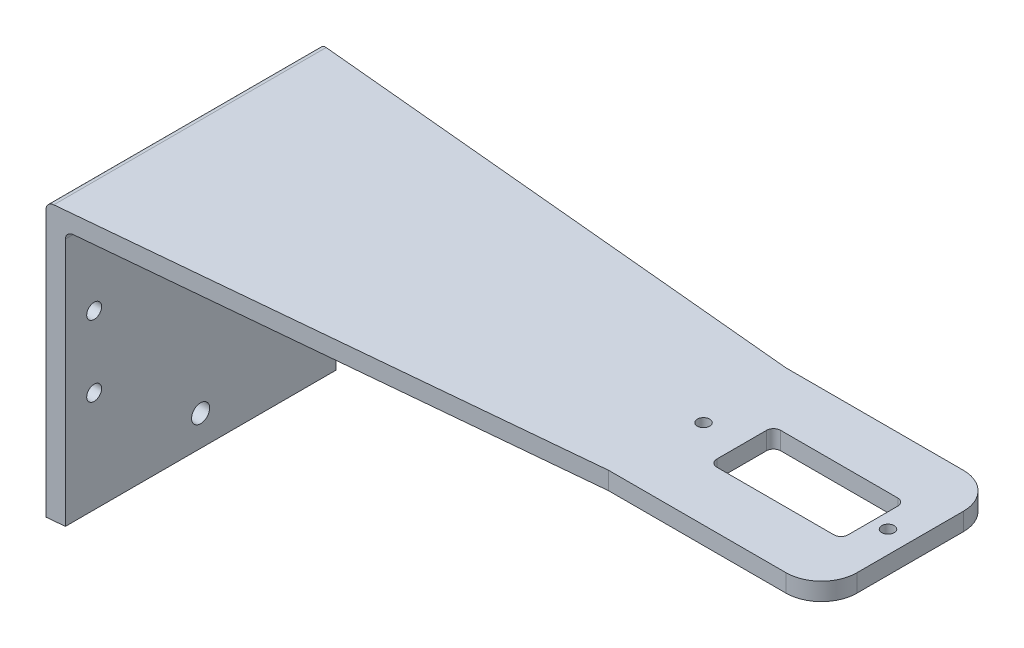
ISO-10303-21;
HEADER;
FILE_DESCRIPTION(('STEP AP214'),'2;1');
FILE_NAME('part.step','',(''),(''),'','','');
FILE_SCHEMA(('AUTOMOTIVE_DESIGN { 1 0 10303 214 1 1 1 1 }'));
ENDSEC;
DATA;
#1=APPLICATION_CONTEXT('core data for automotive mechanical design processes');
#2=APPLICATION_PROTOCOL_DEFINITION('international standard','automotive_design',2000,#1);
#3=PRODUCT_CONTEXT('',#1,'mechanical');
#4=PRODUCT('Part','Part','',(#3));
#5=PRODUCT_RELATED_PRODUCT_CATEGORY('part','',(#4));
#6=PRODUCT_DEFINITION_FORMATION('','',#4);
#7=PRODUCT_DEFINITION_CONTEXT('part definition',#1,'design');
#8=PRODUCT_DEFINITION('design','',#6,#7);
#9=PRODUCT_DEFINITION_SHAPE('','',#8);
#10=(LENGTH_UNIT() NAMED_UNIT(*) SI_UNIT(.MILLI.,.METRE.));
#11=(NAMED_UNIT(*) PLANE_ANGLE_UNIT() SI_UNIT($,.RADIAN.));
#12=(NAMED_UNIT(*) SI_UNIT($,.STERADIAN.) SOLID_ANGLE_UNIT());
#13=UNCERTAINTY_MEASURE_WITH_UNIT(LENGTH_MEASURE(1.E-05),#10,'distance_accuracy_value','');
#14=(GEOMETRIC_REPRESENTATION_CONTEXT(3) GLOBAL_UNCERTAINTY_ASSIGNED_CONTEXT((#13)) GLOBAL_UNIT_ASSIGNED_CONTEXT((#10,
#11,#12)) REPRESENTATION_CONTEXT('',''));
#15=CARTESIAN_POINT('',(0.,0.,0.));
#16=DIRECTION('',(0.,0.,1.));
#17=DIRECTION('',(1.,0.,0.));
#18=AXIS2_PLACEMENT_3D('',#15,#16,#17);
#19=CARTESIAN_POINT('',(-29.1179032258064,28.3712903225806,77.15));
#20=DIRECTION('',(1.,0.,0.));
#21=DIRECTION('',(0.,0.,-1.));
#22=AXIS2_PLACEMENT_3D('',#19,#20,#21);
#23=PLANE('',#22);
#24=CARTESIAN_POINT('',(-29.1179032258064,-0.203709677419655,8.57500000000008));
#25=DIRECTION('',(-1.,0.,0.));
#26=DIRECTION('',(0.,0.,1.));
#27=AXIS2_PLACEMENT_3D('',#24,#25,#26);
#28=CIRCLE('',#27,2.1);
#29=CARTESIAN_POINT('',(-29.1179032258064,-0.203709677419655,10.6750000000001));
#30=VERTEX_POINT('',#29);
#31=EDGE_CURVE('E448',#30,#30,#28,.T.);
#32=ORIENTED_EDGE('',*,*,#31,.F.);
#33=EDGE_LOOP('',(#32));
#34=FACE_BOUND('',#33,.T.);
#35=CARTESIAN_POINT('',(-29.1179032258064,-20.2037096774195,68.5750000000001));
#36=DIRECTION('',(-1.,0.,0.));
#37=DIRECTION('',(0.,0.,1.));
#38=AXIS2_PLACEMENT_3D('',#35,#36,#37);
#39=CIRCLE('',#38,2.09999999999999);
#40=CARTESIAN_POINT('',(-29.1179032258064,-20.2037096774195,70.6750000000001));
#41=VERTEX_POINT('',#40);
#42=EDGE_CURVE('E454',#41,#41,#39,.T.);
#43=ORIENTED_EDGE('',*,*,#42,.F.);
#44=EDGE_LOOP('',(#43));
#45=FACE_BOUND('',#44,.T.);
#46=DIRECTION('',(0.,-1.,0.));
#47=VECTOR('',#46,1.);
#48=CARTESIAN_POINT('',(-29.1179032258064,28.3712903225806,77.15));
#49=LINE('',#48,#47);
#50=CARTESIAN_POINT('',(-29.1179032258064,26.3712903225807,77.15));
#51=VERTEX_POINT('',#50);
#52=CARTESIAN_POINT('',(-29.1179032258064,-48.7787096774194,77.15));
#53=VERTEX_POINT('',#52);
#54=EDGE_CURVE('E265',#51,#53,#49,.T.);
#55=ORIENTED_EDGE('',*,*,#54,.F.);
#56=DIRECTION('',(0.,0.,-1.));
#57=VECTOR('',#56,1.);
#58=CARTESIAN_POINT('',(-29.1179032258064,26.3712903225807,77.15));
#59=LINE('',#58,#57);
#60=CARTESIAN_POINT('',(-29.1179032258064,26.3712903225807,0.));
#61=VERTEX_POINT('',#60);
#62=EDGE_CURVE('E308',#51,#61,#59,.T.);
#63=ORIENTED_EDGE('',*,*,#62,.T.);
#64=DIRECTION('',(0.,-1.,0.));
#65=VECTOR('',#64,1.);
#66=CARTESIAN_POINT('',(-29.1179032258064,28.3712903225806,0.));
#67=LINE('',#66,#65);
#68=CARTESIAN_POINT('',(-29.1179032258064,-48.7787096774194,0.));
#69=VERTEX_POINT('',#68);
#70=EDGE_CURVE('E202',#61,#69,#67,.T.);
#71=ORIENTED_EDGE('',*,*,#70,.T.);
#72=DIRECTION('',(0.,0.,-1.));
#73=VECTOR('',#72,1.);
#74=CARTESIAN_POINT('',(-29.1179032258064,-48.7787096774194,77.15));
#75=LINE('',#74,#73);
#76=EDGE_CURVE('E276',#53,#69,#75,.T.);
#77=ORIENTED_EDGE('',*,*,#76,.F.);
#78=EDGE_LOOP('',(#55,#63,#71,#77));
#79=FACE_BOUND('',#78,.T.);
#80=CARTESIAN_POINT('',(-29.1179032258064,-0.203709677419447,68.5750000000001));
#81=DIRECTION('',(-1.,0.,0.));
#82=DIRECTION('',(0.,0.,1.));
#83=AXIS2_PLACEMENT_3D('',#80,#81,#82);
#84=CIRCLE('',#83,2.1);
#85=CARTESIAN_POINT('',(-29.1179032258064,-0.203709677419447,70.6750000000001));
#86=VERTEX_POINT('',#85);
#87=EDGE_CURVE('E457',#86,#86,#84,.T.);
#88=ORIENTED_EDGE('',*,*,#87,.F.);
#89=EDGE_LOOP('',(#88));
#90=FACE_BOUND('',#89,.T.);
#91=CARTESIAN_POINT('',(-29.1179032258064,-40.2037096774196,38.5750000000002));
#92=DIRECTION('',(-1.,0.,0.));
#93=DIRECTION('',(0.,0.,1.));
#94=AXIS2_PLACEMENT_3D('',#91,#92,#93);
#95=CIRCLE('',#94,2.55000000000002);
#96=CARTESIAN_POINT('',(-29.1179032258064,-40.2037096774196,41.1250000000002));
#97=VERTEX_POINT('',#96);
#98=EDGE_CURVE('E451',#97,#97,#95,.T.);
#99=ORIENTED_EDGE('',*,*,#98,.F.);
#100=EDGE_LOOP('',(#99));
#101=FACE_BOUND('',#100,.T.);
#102=CARTESIAN_POINT('',(-29.1179032258064,-20.2037096774197,8.57500000000014));
#103=DIRECTION('',(-1.,0.,0.));
#104=DIRECTION('',(0.,0.,1.));
#105=AXIS2_PLACEMENT_3D('',#102,#103,#104);
#106=CIRCLE('',#105,2.1);
#107=CARTESIAN_POINT('',(-29.1179032258064,-20.2037096774197,10.6750000000001));
#108=VERTEX_POINT('',#107);
#109=EDGE_CURVE('E221',#108,#108,#106,.T.);
#110=ORIENTED_EDGE('',*,*,#109,.F.);
#111=EDGE_LOOP('',(#110));
#112=FACE_BOUND('',#111,.T.);
#113=ADVANCED_FACE('F42',(#34,#45,#79,#90,#101,#112),#23,.F.);
#114=CARTESIAN_POINT('',(-24.1179032258064,-48.7787096774193,77.15));
#115=DIRECTION('',(-1.,0.,0.));
#116=DIRECTION('',(0.,-1.,0.));
#117=AXIS2_PLACEMENT_3D('',#114,#115,#116);
#118=PLANE('',#117);
#119=CARTESIAN_POINT('',(-24.1179032258064,-0.203709677419655,8.57500000000008));
#120=DIRECTION('',(-1.,0.,0.));
#121=DIRECTION('',(0.,-1.,0.));
#122=AXIS2_PLACEMENT_3D('',#119,#120,#121);
#123=CIRCLE('',#122,2.1);
#124=CARTESIAN_POINT('',(-24.1179032258064,-2.30370967741965,8.57500000000008));
#125=VERTEX_POINT('',#124);
#126=EDGE_CURVE('E463',#125,#125,#123,.F.);
#127=ORIENTED_EDGE('',*,*,#126,.F.);
#128=EDGE_LOOP('',(#127));
#129=FACE_BOUND('',#128,.T.);
#130=CARTESIAN_POINT('',(-24.1179032258064,-20.2037096774195,68.5750000000001));
#131=DIRECTION('',(-1.,0.,0.));
#132=DIRECTION('',(0.,-1.,0.));
#133=AXIS2_PLACEMENT_3D('',#130,#131,#132);
#134=CIRCLE('',#133,2.09999999999999);
#135=CARTESIAN_POINT('',(-24.1179032258064,-22.3037096774194,68.5750000000001));
#136=VERTEX_POINT('',#135);
#137=EDGE_CURVE('E445',#136,#136,#134,.F.);
#138=ORIENTED_EDGE('',*,*,#137,.F.);
#139=EDGE_LOOP('',(#138));
#140=FACE_BOUND('',#139,.T.);
#141=DIRECTION('',(0.,-1.,0.));
#142=VECTOR('',#141,1.);
#143=CARTESIAN_POINT('',(-24.1179032258064,-48.7797096774194,0.468103448275862));
#144=LINE('',#143,#142);
#145=CARTESIAN_POINT('',(-24.1179032258064,21.3712903225807,0.468103448275863));
#146=VERTEX_POINT('',#145);
#147=CARTESIAN_POINT('',(-24.1179032258064,-48.7787096774193,0.468103448275862));
#148=VERTEX_POINT('',#147);
#149=EDGE_CURVE('E437',#146,#148,#144,.T.);
#150=ORIENTED_EDGE('',*,*,#149,.F.);
#151=DIRECTION('',(0.,0.,-1.));
#152=VECTOR('',#151,1.);
#153=CARTESIAN_POINT('',(-24.1179032258064,21.3712903225807,76.6818965517242));
#154=LINE('',#153,#152);
#155=CARTESIAN_POINT('',(-24.1179032258064,21.3712903225807,76.6818965517242));
#156=VERTEX_POINT('',#155);
#157=EDGE_CURVE('E306',#146,#156,#154,.F.);
#158=ORIENTED_EDGE('',*,*,#157,.T.);
#159=DIRECTION('',(0.,1.,0.));
#160=VECTOR('',#159,1.);
#161=CARTESIAN_POINT('',(-24.1179032258064,-48.7797096774194,76.6818965517242));
#162=LINE('',#161,#160);
#163=CARTESIAN_POINT('',(-24.1179032258064,-48.7787096774193,76.6818965517242));
#164=VERTEX_POINT('',#163);
#165=EDGE_CURVE('E237',#164,#156,#162,.T.);
#166=ORIENTED_EDGE('',*,*,#165,.F.);
#167=DIRECTION('',(0.,0.,-1.));
#168=VECTOR('',#167,1.);
#169=CARTESIAN_POINT('',(-24.1179032258064,-48.7787096774193,77.15));
#170=LINE('',#169,#168);
#171=EDGE_CURVE('E273',#164,#148,#170,.T.);
#172=ORIENTED_EDGE('',*,*,#171,.T.);
#173=EDGE_LOOP('',(#150,#158,#166,#172));
#174=FACE_BOUND('',#173,.T.);
#175=CARTESIAN_POINT('',(-24.1179032258064,-0.203709677419447,68.5750000000001));
#176=DIRECTION('',(-1.,0.,0.));
#177=DIRECTION('',(0.,-1.,0.));
#178=AXIS2_PLACEMENT_3D('',#175,#176,#177);
#179=CIRCLE('',#178,2.1);
#180=CARTESIAN_POINT('',(-24.1179032258064,-2.30370967741945,68.5750000000001));
#181=VERTEX_POINT('',#180);
#182=EDGE_CURVE('E442',#181,#181,#179,.F.);
#183=ORIENTED_EDGE('',*,*,#182,.F.);
#184=EDGE_LOOP('',(#183));
#185=FACE_BOUND('',#184,.T.);
#186=CARTESIAN_POINT('',(-24.1179032258064,-40.2037096774196,38.5750000000002));
#187=DIRECTION('',(-1.,0.,0.));
#188=DIRECTION('',(0.,-1.,0.));
#189=AXIS2_PLACEMENT_3D('',#186,#187,#188);
#190=CIRCLE('',#189,2.55000000000002);
#191=CARTESIAN_POINT('',(-24.1179032258064,-42.7537096774196,38.5750000000002));
#192=VERTEX_POINT('',#191);
#193=EDGE_CURVE('E466',#192,#192,#190,.F.);
#194=ORIENTED_EDGE('',*,*,#193,.F.);
#195=EDGE_LOOP('',(#194));
#196=FACE_BOUND('',#195,.T.);
#197=CARTESIAN_POINT('',(-24.1179032258064,-20.2037096774197,8.57500000000014));
#198=DIRECTION('',(-1.,0.,0.));
#199=DIRECTION('',(0.,-1.,0.));
#200=AXIS2_PLACEMENT_3D('',#197,#198,#199);
#201=CIRCLE('',#200,2.1);
#202=CARTESIAN_POINT('',(-24.1179032258064,-22.3037096774197,8.57500000000014));
#203=VERTEX_POINT('',#202);
#204=EDGE_CURVE('E460',#203,#203,#201,.F.);
#205=ORIENTED_EDGE('',*,*,#204,.F.);
#206=EDGE_LOOP('',(#205));
#207=FACE_BOUND('',#206,.T.);
#208=ADVANCED_FACE('F367',(#129,#140,#174,#185,#196,#207),#118,.F.);
#209=CARTESIAN_POINT('',(-24.1179032258064,23.3712903225807,77.15));
#210=DIRECTION('',(0.,1.,0.));
#211=DIRECTION('',(0.,0.,1.));
#212=AXIS2_PLACEMENT_3D('',#209,#210,#211);
#213=PLANE('',#212);
#214=DIRECTION('',(0.995646182783314,0.,-0.0932130822847136));
#215=VECTOR('',#214,1.);
#216=CARTESIAN_POINT('',(115.882096774194,23.3712903225807,63.575));
#217=LINE('',#216,#215);
#218=CARTESIAN_POINT('',(-22.1179032258065,23.3712903225807,76.4946551724138));
#219=VERTEX_POINT('',#218);
#220=CARTESIAN_POINT('',(115.882096774194,23.3712903225807,63.575));
#221=VERTEX_POINT('',#220);
#222=EDGE_CURVE('E224',#219,#221,#217,.T.);
#223=ORIENTED_EDGE('',*,*,#222,.F.);
#224=DIRECTION('',(0.,0.,-1.));
#225=VECTOR('',#224,1.);
#226=CARTESIAN_POINT('',(-22.1179032258064,23.3712903225807,0.468103448275858));
#227=LINE('',#226,#225);
#228=CARTESIAN_POINT('',(-22.1179032258065,23.3712903225807,0.655344827586203));
#229=VERTEX_POINT('',#228);
#230=EDGE_CURVE('E303',#219,#229,#227,.T.);
#231=ORIENTED_EDGE('',*,*,#230,.T.);
#232=DIRECTION('',(-0.995646182783314,0.,-0.0932130822847138));
#233=VECTOR('',#232,1.);
#234=CARTESIAN_POINT('',(115.882096774194,23.3712903225807,13.575));
#235=LINE('',#234,#233);
#236=CARTESIAN_POINT('',(115.882096774194,23.3712903225807,13.575));
#237=VERTEX_POINT('',#236);
#238=EDGE_CURVE('E242',#237,#229,#235,.T.);
#239=ORIENTED_EDGE('',*,*,#238,.F.);
#240=DIRECTION('',(0.,0.,-1.));
#241=VECTOR('',#240,1.);
#242=CARTESIAN_POINT('',(115.882096774194,23.3712903225807,77.15));
#243=LINE('',#242,#241);
#244=CARTESIAN_POINT('',(115.882096774194,23.3712903225807,38.575));
#245=VERTEX_POINT('',#244);
#246=EDGE_CURVE('E279',#245,#237,#243,.T.);
#247=ORIENTED_EDGE('',*,*,#246,.F.);
#248=EDGE_CURVE('E282',#221,#245,#243,.T.);
#249=ORIENTED_EDGE('',*,*,#248,.F.);
#250=EDGE_LOOP('',(#223,#231,#239,#247,#249));
#251=FACE_BOUND('',#250,.T.);
#252=ADVANCED_FACE('F373',(#251),#213,.F.);
#253=CARTESIAN_POINT('',(175.882096774194,28.3712903225807,77.15));
#254=DIRECTION('',(0.,-1.,0.));
#255=DIRECTION('',(1.,0.,0.));
#256=AXIS2_PLACEMENT_3D('',#253,#254,#255);
#257=PLANE('',#256);
#258=CARTESIAN_POINT('',(117.632096774194,28.3712903225807,38.575));
#259=DIRECTION('',(0.,1.,0.));
#260=DIRECTION('',(-1.,0.,0.));
#261=AXIS2_PLACEMENT_3D('',#258,#259,#260);
#262=CIRCLE('',#261,1.75);
#263=CARTESIAN_POINT('',(115.882096774194,28.3712903225807,38.575));
#264=VERTEX_POINT('',#263);
#265=EDGE_CURVE('E218',#264,#264,#262,.T.);
#266=ORIENTED_EDGE('',*,*,#265,.F.);
#267=EDGE_LOOP('',(#266));
#268=FACE_BOUND('',#267,.T.);
#269=CARTESIAN_POINT('',(169.632096774194,28.3712903225807,38.575));
#270=DIRECTION('',(0.,1.,0.));
#271=DIRECTION('',(-1.,0.,0.));
#272=AXIS2_PLACEMENT_3D('',#269,#270,#271);
#273=CIRCLE('',#272,1.75000000000001);
#274=CARTESIAN_POINT('',(167.882096774194,28.3712903225807,38.575));
#275=VERTEX_POINT('',#274);
#276=EDGE_CURVE('E210',#275,#275,#273,.T.);
#277=ORIENTED_EDGE('',*,*,#276,.F.);
#278=EDGE_LOOP('',(#277));
#279=FACE_BOUND('',#278,.T.);
#280=DIRECTION('',(1.,0.,0.));
#281=VECTOR('',#280,1.);
#282=CARTESIAN_POINT('',(128.382096774194,28.3712903225807,47.575));
#283=LINE('',#282,#281);
#284=CARTESIAN_POINT('',(130.382096774194,28.3712903225807,47.575));
#285=VERTEX_POINT('',#284);
#286=CARTESIAN_POINT('',(163.382096774194,28.3712903225807,47.575));
#287=VERTEX_POINT('',#286);
#288=EDGE_CURVE('E254',#285,#287,#283,.T.);
#289=ORIENTED_EDGE('',*,*,#288,.F.);
#290=CARTESIAN_POINT('',(130.382096774194,28.3712903225807,45.575));
#291=DIRECTION('',(0.,-1.,0.));
#292=DIRECTION('',(1.,0.,0.));
#293=AXIS2_PLACEMENT_3D('',#290,#291,#292);
#294=CIRCLE('',#293,2.);
#295=CARTESIAN_POINT('',(128.382096774194,28.3712903225807,45.575));
#296=VERTEX_POINT('',#295);
#297=EDGE_CURVE('E320',#285,#296,#294,.T.);
#298=ORIENTED_EDGE('',*,*,#297,.T.);
#299=DIRECTION('',(0.,0.,1.));
#300=VECTOR('',#299,1.);
#301=CARTESIAN_POINT('',(128.382096774194,28.3712903225807,29.575));
#302=LINE('',#301,#300);
#303=CARTESIAN_POINT('',(128.382096774194,28.3712903225807,31.575));
#304=VERTEX_POINT('',#303);
#305=EDGE_CURVE('E251',#304,#296,#302,.T.);
#306=ORIENTED_EDGE('',*,*,#305,.F.);
#307=CARTESIAN_POINT('',(130.382096774194,28.3712903225807,31.575));
#308=DIRECTION('',(0.,-1.,0.));
#309=DIRECTION('',(1.,0.,0.));
#310=AXIS2_PLACEMENT_3D('',#307,#308,#309);
#311=CIRCLE('',#310,2.);
#312=CARTESIAN_POINT('',(130.382096774194,28.3712903225807,29.575));
#313=VERTEX_POINT('',#312);
#314=EDGE_CURVE('E328',#304,#313,#311,.T.);
#315=ORIENTED_EDGE('',*,*,#314,.T.);
#316=DIRECTION('',(-1.,0.,0.));
#317=VECTOR('',#316,1.);
#318=CARTESIAN_POINT('',(128.382096774194,28.3712903225807,29.575));
#319=LINE('',#318,#317);
#320=CARTESIAN_POINT('',(163.382096774194,28.3712903225807,29.575));
#321=VERTEX_POINT('',#320);
#322=EDGE_CURVE('E260',#321,#313,#319,.T.);
#323=ORIENTED_EDGE('',*,*,#322,.F.);
#324=CARTESIAN_POINT('',(163.382096774194,28.3712903225807,31.575));
#325=DIRECTION('',(0.,-1.,0.));
#326=DIRECTION('',(1.,0.,0.));
#327=AXIS2_PLACEMENT_3D('',#324,#325,#326);
#328=CIRCLE('',#327,2.);
#329=CARTESIAN_POINT('',(165.382096774194,28.3712903225807,31.575));
#330=VERTEX_POINT('',#329);
#331=EDGE_CURVE('E324',#321,#330,#328,.T.);
#332=ORIENTED_EDGE('',*,*,#331,.T.);
#333=DIRECTION('',(0.,0.,-1.));
#334=VECTOR('',#333,1.);
#335=CARTESIAN_POINT('',(165.382096774194,28.3712903225807,29.575));
#336=LINE('',#335,#334);
#337=CARTESIAN_POINT('',(165.382096774194,28.3712903225807,45.575));
#338=VERTEX_POINT('',#337);
#339=EDGE_CURVE('E257',#338,#330,#336,.T.);
#340=ORIENTED_EDGE('',*,*,#339,.F.);
#341=CARTESIAN_POINT('',(163.382096774194,28.3712903225807,45.575));
#342=DIRECTION('',(0.,-1.,0.));
#343=DIRECTION('',(1.,0.,0.));
#344=AXIS2_PLACEMENT_3D('',#341,#342,#343);
#345=CIRCLE('',#344,2.);
#346=EDGE_CURVE('E316',#338,#287,#345,.T.);
#347=ORIENTED_EDGE('',*,*,#346,.T.);
#348=EDGE_LOOP('',(#289,#298,#306,#315,#323,#332,#340,#347));
#349=FACE_BOUND('',#348,.T.);
#350=DIRECTION('',(0.,0.,-1.));
#351=VECTOR('',#350,1.);
#352=CARTESIAN_POINT('',(175.882096774194,28.3712903225807,77.15));
#353=LINE('',#352,#351);
#354=CARTESIAN_POINT('',(175.882096774194,28.3712903225807,53.575));
#355=VERTEX_POINT('',#354);
#356=CARTESIAN_POINT('',(175.882096774194,28.3712903225807,23.575));
#357=VERTEX_POINT('',#356);
#358=EDGE_CURVE('E267',#355,#357,#353,.T.);
#359=ORIENTED_EDGE('',*,*,#358,.T.);
#360=CARTESIAN_POINT('',(165.882096774194,28.3712903225807,23.575));
#361=DIRECTION('',(0.,-1.,0.));
#362=DIRECTION('',(1.,0.,0.));
#363=AXIS2_PLACEMENT_3D('',#360,#361,#362);
#364=CIRCLE('',#363,10.);
#365=CARTESIAN_POINT('',(165.882096774194,28.3712903225807,13.575));
#366=VERTEX_POINT('',#365);
#367=EDGE_CURVE('E206',#357,#366,#364,.F.);
#368=ORIENTED_EDGE('',*,*,#367,.T.);
#369=DIRECTION('',(1.,0.,0.));
#370=VECTOR('',#369,1.);
#371=CARTESIAN_POINT('',(175.882096774194,28.3712903225807,13.575));
#372=LINE('',#371,#370);
#373=CARTESIAN_POINT('',(115.882096774194,28.3712903225807,13.575));
#374=VERTEX_POINT('',#373);
#375=EDGE_CURVE('E196',#374,#366,#372,.T.);
#376=ORIENTED_EDGE('',*,*,#375,.F.);
#377=DIRECTION('',(0.995646182783313,0.,0.0932130822847138));
#378=VECTOR('',#377,1.);
#379=CARTESIAN_POINT('',(115.882096774194,28.3712903225807,13.575));
#380=LINE('',#379,#378);
#381=CARTESIAN_POINT('',(-27.1179032258064,28.3712903225806,0.187241379310346));
#382=VERTEX_POINT('',#381);
#383=EDGE_CURVE('E185',#382,#374,#380,.T.);
#384=ORIENTED_EDGE('',*,*,#383,.F.);
#385=DIRECTION('',(0.,0.,-1.));
#386=VECTOR('',#385,1.);
#387=CARTESIAN_POINT('',(-27.1179032258064,28.3712903225806,77.15));
#388=LINE('',#387,#386);
#389=CARTESIAN_POINT('',(-27.1179032258064,28.3712903225806,76.9627586206897));
#390=VERTEX_POINT('',#389);
#391=EDGE_CURVE('E312',#382,#390,#388,.F.);
#392=ORIENTED_EDGE('',*,*,#391,.T.);
#393=DIRECTION('',(-0.995646182783313,0.,0.0932130822847136));
#394=VECTOR('',#393,1.);
#395=CARTESIAN_POINT('',(115.882096774194,28.3712903225807,63.575));
#396=LINE('',#395,#394);
#397=CARTESIAN_POINT('',(115.882096774194,28.3712903225807,63.575));
#398=VERTEX_POINT('',#397);
#399=EDGE_CURVE('E229',#398,#390,#396,.T.);
#400=ORIENTED_EDGE('',*,*,#399,.F.);
#401=DIRECTION('',(-1.,0.,0.));
#402=VECTOR('',#401,1.);
#403=CARTESIAN_POINT('',(175.882096774194,28.3712903225807,63.575));
#404=LINE('',#403,#402);
#405=CARTESIAN_POINT('',(165.882096774194,28.3712903225807,63.575));
#406=VERTEX_POINT('',#405);
#407=EDGE_CURVE('E226',#406,#398,#404,.T.);
#408=ORIENTED_EDGE('',*,*,#407,.F.);
#409=CARTESIAN_POINT('',(165.882096774194,28.3712903225807,53.575));
#410=DIRECTION('',(0.,-1.,0.));
#411=DIRECTION('',(1.,0.,0.));
#412=AXIS2_PLACEMENT_3D('',#409,#410,#411);
#413=CIRCLE('',#412,10.);
#414=EDGE_CURVE('E341',#406,#355,#413,.F.);
#415=ORIENTED_EDGE('',*,*,#414,.T.);
#416=EDGE_LOOP('',(#359,#368,#376,#384,#392,#400,#408,#415));
#417=FACE_BOUND('',#416,.T.);
#418=ADVANCED_FACE('F205',(#268,#279,#349,#417),#257,.F.);
#419=CARTESIAN_POINT('',(-29.1179032258064,-48.7787096774194,77.15));
#420=DIRECTION('',(0.,1.,0.));
#421=DIRECTION('',(-1.,0.,0.));
#422=AXIS2_PLACEMENT_3D('',#419,#420,#421);
#423=PLANE('',#422);
#424=ORIENTED_EDGE('',*,*,#76,.T.);
#425=DIRECTION('',(-0.995646182783314,0.,-0.0932130822847138));
#426=VECTOR('',#425,1.);
#427=CARTESIAN_POINT('',(115.882096774194,-48.7787096774167,13.575));
#428=LINE('',#427,#426);
#429=EDGE_CURVE('E197',#148,#69,#428,.T.);
#430=ORIENTED_EDGE('',*,*,#429,.F.);
#431=ORIENTED_EDGE('',*,*,#171,.F.);
#432=DIRECTION('',(0.995646182783314,0.,-0.0932130822847136));
#433=VECTOR('',#432,1.);
#434=CARTESIAN_POINT('',(115.882096774194,-48.7787096774167,63.575));
#435=LINE('',#434,#433);
#436=EDGE_CURVE('E240',#53,#164,#435,.T.);
#437=ORIENTED_EDGE('',*,*,#436,.F.);
#438=EDGE_LOOP('',(#424,#430,#431,#437));
#439=FACE_BOUND('',#438,.T.);
#440=ADVANCED_FACE('F380',(#439),#423,.F.);
#441=DIRECTION('',(-1.,0.,0.));
#442=VECTOR('',#441,1.);
#443=CARTESIAN_POINT('',(175.882096774194,23.3712903225807,13.575));
#444=LINE('',#443,#442);
#445=CARTESIAN_POINT('',(165.882096774194,23.3712903225807,13.575));
#446=VERTEX_POINT('',#445);
#447=EDGE_CURVE('E200',#446,#237,#444,.T.);
#448=ORIENTED_EDGE('',*,*,#447,.F.);
#449=CARTESIAN_POINT('',(165.882096774194,23.3712903225807,23.575));
#450=DIRECTION('',(0.,1.,0.));
#451=DIRECTION('',(0.,0.,1.));
#452=AXIS2_PLACEMENT_3D('',#449,#450,#451);
#453=CIRCLE('',#452,10.);
#454=CARTESIAN_POINT('',(175.882096774194,23.3712903225807,23.575));
#455=VERTEX_POINT('',#454);
#456=EDGE_CURVE('E50',#446,#455,#453,.F.);
#457=ORIENTED_EDGE('',*,*,#456,.T.);
#458=DIRECTION('',(0.,0.,-1.));
#459=VECTOR('',#458,1.);
#460=CARTESIAN_POINT('',(175.882096774194,23.3712903225807,77.15));
#461=LINE('',#460,#459);
#462=CARTESIAN_POINT('',(175.882096774194,23.3712903225807,53.575));
#463=VERTEX_POINT('',#462);
#464=EDGE_CURVE('E270',#463,#455,#461,.T.);
#465=ORIENTED_EDGE('',*,*,#464,.F.);
#466=CARTESIAN_POINT('',(165.882096774194,23.3712903225807,53.575));
#467=DIRECTION('',(0.,1.,0.));
#468=DIRECTION('',(0.,0.,1.));
#469=AXIS2_PLACEMENT_3D('',#466,#467,#468);
#470=CIRCLE('',#469,10.);
#471=CARTESIAN_POINT('',(165.882096774194,23.3712903225807,63.575));
#472=VERTEX_POINT('',#471);
#473=EDGE_CURVE('E57',#463,#472,#470,.F.);
#474=ORIENTED_EDGE('',*,*,#473,.T.);
#475=DIRECTION('',(1.,0.,0.));
#476=VECTOR('',#475,1.);
#477=CARTESIAN_POINT('',(175.882096774194,23.3712903225807,63.575));
#478=LINE('',#477,#476);
#479=EDGE_CURVE('E235',#221,#472,#478,.T.);
#480=ORIENTED_EDGE('',*,*,#479,.F.);
#481=ORIENTED_EDGE('',*,*,#248,.T.);
#482=CARTESIAN_POINT('',(117.632096774194,23.3712903225807,38.575));
#483=DIRECTION('',(0.,1.,0.));
#484=DIRECTION('',(0.,0.,1.));
#485=AXIS2_PLACEMENT_3D('',#482,#483,#484);
#486=CIRCLE('',#485,1.75);
#487=EDGE_CURVE('E214',#245,#245,#486,.F.);
#488=ORIENTED_EDGE('',*,*,#487,.F.);
#489=ORIENTED_EDGE('',*,*,#246,.T.);
#490=EDGE_LOOP('',(#448,#457,#465,#474,#480,#481,#488,#489));
#491=FACE_BOUND('',#490,.T.);
#492=CARTESIAN_POINT('',(169.632096774194,23.3712903225807,38.575));
#493=DIRECTION('',(0.,1.,0.));
#494=DIRECTION('',(0.,0.,1.));
#495=AXIS2_PLACEMENT_3D('',#492,#493,#494);
#496=CIRCLE('',#495,1.75000000000001);
#497=CARTESIAN_POINT('',(169.632096774194,23.3712903225807,40.325));
#498=VERTEX_POINT('',#497);
#499=EDGE_CURVE('E213',#498,#498,#496,.F.);
#500=ORIENTED_EDGE('',*,*,#499,.F.);
#501=EDGE_LOOP('',(#500));
#502=FACE_BOUND('',#501,.T.);
#503=DIRECTION('',(1.,0.,0.));
#504=VECTOR('',#503,1.);
#505=CARTESIAN_POINT('',(128.382096774194,23.3712903225807,29.575));
#506=LINE('',#505,#504);
#507=CARTESIAN_POINT('',(130.382096774194,23.3712903225807,29.575));
#508=VERTEX_POINT('',#507);
#509=CARTESIAN_POINT('',(163.382096774194,23.3712903225807,29.575));
#510=VERTEX_POINT('',#509);
#511=EDGE_CURVE('E245',#508,#510,#506,.T.);
#512=ORIENTED_EDGE('',*,*,#511,.F.);
#513=CARTESIAN_POINT('',(130.382096774194,23.3712903225807,31.575));
#514=DIRECTION('',(0.,1.,0.));
#515=DIRECTION('',(0.,0.,1.));
#516=AXIS2_PLACEMENT_3D('',#513,#514,#515);
#517=CIRCLE('',#516,2.);
#518=CARTESIAN_POINT('',(128.382096774194,23.3712903225807,31.575));
#519=VERTEX_POINT('',#518);
#520=EDGE_CURVE('E330',#508,#519,#517,.T.);
#521=ORIENTED_EDGE('',*,*,#520,.T.);
#522=DIRECTION('',(0.,0.,-1.));
#523=VECTOR('',#522,1.);
#524=CARTESIAN_POINT('',(128.382096774194,23.3712903225807,29.575));
#525=LINE('',#524,#523);
#526=CARTESIAN_POINT('',(128.382096774194,23.3712903225807,45.575));
#527=VERTEX_POINT('',#526);
#528=EDGE_CURVE('E248',#527,#519,#525,.T.);
#529=ORIENTED_EDGE('',*,*,#528,.F.);
#530=CARTESIAN_POINT('',(130.382096774194,23.3712903225807,45.575));
#531=DIRECTION('',(0.,1.,0.));
#532=DIRECTION('',(0.,0.,1.));
#533=AXIS2_PLACEMENT_3D('',#530,#531,#532);
#534=CIRCLE('',#533,2.);
#535=CARTESIAN_POINT('',(130.382096774194,23.3712903225807,47.575));
#536=VERTEX_POINT('',#535);
#537=EDGE_CURVE('E322',#527,#536,#534,.T.);
#538=ORIENTED_EDGE('',*,*,#537,.T.);
#539=DIRECTION('',(-1.,0.,0.));
#540=VECTOR('',#539,1.);
#541=CARTESIAN_POINT('',(128.382096774194,23.3712903225807,47.575));
#542=LINE('',#541,#540);
#543=CARTESIAN_POINT('',(163.382096774194,23.3712903225807,47.575));
#544=VERTEX_POINT('',#543);
#545=EDGE_CURVE('E227',#544,#536,#542,.T.);
#546=ORIENTED_EDGE('',*,*,#545,.F.);
#547=CARTESIAN_POINT('',(163.382096774194,23.3712903225807,45.575));
#548=DIRECTION('',(0.,1.,0.));
#549=DIRECTION('',(0.,0.,1.));
#550=AXIS2_PLACEMENT_3D('',#547,#548,#549);
#551=CIRCLE('',#550,2.);
#552=CARTESIAN_POINT('',(165.382096774194,23.3712903225807,45.575));
#553=VERTEX_POINT('',#552);
#554=EDGE_CURVE('E318',#544,#553,#551,.T.);
#555=ORIENTED_EDGE('',*,*,#554,.T.);
#556=DIRECTION('',(0.,0.,1.));
#557=VECTOR('',#556,1.);
#558=CARTESIAN_POINT('',(165.382096774194,23.3712903225807,29.575));
#559=LINE('',#558,#557);
#560=CARTESIAN_POINT('',(165.382096774194,23.3712903225807,31.575));
#561=VERTEX_POINT('',#560);
#562=EDGE_CURVE('E217',#561,#553,#559,.T.);
#563=ORIENTED_EDGE('',*,*,#562,.F.);
#564=CARTESIAN_POINT('',(163.382096774194,23.3712903225807,31.575));
#565=DIRECTION('',(0.,1.,0.));
#566=DIRECTION('',(0.,0.,1.));
#567=AXIS2_PLACEMENT_3D('',#564,#565,#566);
#568=CIRCLE('',#567,2.);
#569=EDGE_CURVE('E326',#561,#510,#568,.T.);
#570=ORIENTED_EDGE('',*,*,#569,.T.);
#571=EDGE_LOOP('',(#512,#521,#529,#538,#546,#555,#563,#570));
#572=FACE_BOUND('',#571,.T.);
#573=ADVANCED_FACE('F346',(#491,#502,#572),#213,.F.);
#574=CARTESIAN_POINT('',(175.882096774194,23.3712903225807,77.15));
#575=DIRECTION('',(-1.,0.,0.));
#576=DIRECTION('',(0.,0.,1.));
#577=AXIS2_PLACEMENT_3D('',#574,#575,#576);
#578=PLANE('',#577);
#579=ORIENTED_EDGE('',*,*,#464,.T.);
#580=DIRECTION('',(0.,1.,0.));
#581=VECTOR('',#580,1.);
#582=CARTESIAN_POINT('',(175.882096774194,23.3712903225807,23.575));
#583=LINE('',#582,#581);
#584=EDGE_CURVE('E338',#455,#357,#583,.T.);
#585=ORIENTED_EDGE('',*,*,#584,.T.);
#586=ORIENTED_EDGE('',*,*,#358,.F.);
#587=DIRECTION('',(0.,1.,0.));
#588=VECTOR('',#587,1.);
#589=CARTESIAN_POINT('',(175.882096774194,23.3712903225807,53.575));
#590=LINE('',#589,#588);
#591=EDGE_CURVE('E336',#355,#463,#590,.F.);
#592=ORIENTED_EDGE('',*,*,#591,.T.);
#593=EDGE_LOOP('',(#579,#585,#586,#592));
#594=FACE_BOUND('',#593,.T.);
#595=ADVANCED_FACE('F351',(#594),#578,.F.);
#596=CARTESIAN_POINT('',(175.882096774194,-48.7797096774194,13.575));
#597=DIRECTION('',(0.,0.,1.));
#598=DIRECTION('',(1.,0.,0.));
#599=AXIS2_PLACEMENT_3D('',#596,#597,#598);
#600=PLANE('',#599);
#601=ORIENTED_EDGE('',*,*,#375,.T.);
#602=DIRECTION('',(0.,1.,0.));
#603=VECTOR('',#602,1.);
#604=CARTESIAN_POINT('',(165.882096774194,-48.7797096774194,13.575));
#605=LINE('',#604,#603);
#606=EDGE_CURVE('E65',#366,#446,#605,.F.);
#607=ORIENTED_EDGE('',*,*,#606,.T.);
#608=ORIENTED_EDGE('',*,*,#447,.T.);
#609=DIRECTION('',(0.,1.,0.));
#610=VECTOR('',#609,1.);
#611=CARTESIAN_POINT('',(115.882096774194,-48.7797096774194,13.575));
#612=LINE('',#611,#610);
#613=EDGE_CURVE('E190',#237,#374,#612,.T.);
#614=ORIENTED_EDGE('',*,*,#613,.T.);
#615=EDGE_LOOP('',(#601,#607,#608,#614));
#616=FACE_BOUND('',#615,.T.);
#617=ADVANCED_FACE('F199',(#616),#600,.F.);
#618=CARTESIAN_POINT('',(115.882096774194,-48.7797096774194,13.575));
#619=DIRECTION('',(-0.0932130822847138,0.,0.995646182783314));
#620=DIRECTION('',(0.995646182783314,0.,0.0932130822847138));
#621=AXIS2_PLACEMENT_3D('',#618,#619,#620);
#622=PLANE('',#621);
#623=ORIENTED_EDGE('',*,*,#70,.F.);
#624=CARTESIAN_POINT('',(-27.1179032258064,26.3712903225807,0.187241379310352));
#625=DIRECTION('',(-0.0932130822847138,0.,0.995646182783314));
#626=DIRECTION('',(-0.995646182783314,0.,-0.0932130822847138));
#627=AXIS2_PLACEMENT_3D('',#624,#625,#626);
#628=ELLIPSE('',#627,2.00874571166338,2.);
#629=EDGE_CURVE('E192',#61,#382,#628,.F.);
#630=ORIENTED_EDGE('',*,*,#629,.T.);
#631=ORIENTED_EDGE('',*,*,#383,.T.);
#632=ORIENTED_EDGE('',*,*,#613,.F.);
#633=ORIENTED_EDGE('',*,*,#238,.T.);
#634=CARTESIAN_POINT('',(-22.1179032258064,21.3712903225807,0.65534482758621));
#635=DIRECTION('',(-0.0932130822847138,0.,0.995646182783314));
#636=DIRECTION('',(0.995646182783314,0.,0.0932130822847138));
#637=AXIS2_PLACEMENT_3D('',#634,#635,#636);
#638=ELLIPSE('',#637,2.00874571166338,2.);
#639=EDGE_CURVE('E332',#229,#146,#638,.T.);
#640=ORIENTED_EDGE('',*,*,#639,.T.);
#641=ORIENTED_EDGE('',*,*,#149,.T.);
#642=ORIENTED_EDGE('',*,*,#429,.T.);
#643=EDGE_LOOP('',(#623,#630,#631,#632,#633,#640,#641,#642));
#644=FACE_BOUND('',#643,.T.);
#645=ADVANCED_FACE('F188',(#644),#622,.F.);
#646=CARTESIAN_POINT('',(115.882096774194,-48.7797096774194,63.575));
#647=DIRECTION('',(-0.0932130822847136,0.,-0.995646182783314));
#648=DIRECTION('',(-0.995646182783314,0.,0.0932130822847136));
#649=AXIS2_PLACEMENT_3D('',#646,#647,#648);
#650=PLANE('',#649);
#651=ORIENTED_EDGE('',*,*,#399,.T.);
#652=CARTESIAN_POINT('',(-27.1179032258064,26.3712903225807,76.9627586206897));
#653=DIRECTION('',(-0.0932130822847136,0.,-0.995646182783314));
#654=DIRECTION('',(0.995646182783314,0.,-0.0932130822847136));
#655=AXIS2_PLACEMENT_3D('',#652,#653,#654);
#656=ELLIPSE('',#655,2.00874571166338,2.);
#657=EDGE_CURVE('E314',#390,#51,#656,.F.);
#658=ORIENTED_EDGE('',*,*,#657,.T.);
#659=ORIENTED_EDGE('',*,*,#54,.T.);
#660=ORIENTED_EDGE('',*,*,#436,.T.);
#661=ORIENTED_EDGE('',*,*,#165,.T.);
#662=CARTESIAN_POINT('',(-22.1179032258064,21.3712903225807,76.4946551724138));
#663=DIRECTION('',(-0.0932130822847136,0.,-0.995646182783314));
#664=DIRECTION('',(-0.995646182783314,0.,0.0932130822847136));
#665=AXIS2_PLACEMENT_3D('',#662,#663,#664);
#666=ELLIPSE('',#665,2.00874571166338,2.);
#667=EDGE_CURVE('E334',#156,#219,#666,.T.);
#668=ORIENTED_EDGE('',*,*,#667,.T.);
#669=ORIENTED_EDGE('',*,*,#222,.T.);
#670=DIRECTION('',(0.,1.,0.));
#671=VECTOR('',#670,1.);
#672=CARTESIAN_POINT('',(115.882096774194,-48.7797096774194,63.575));
#673=LINE('',#672,#671);
#674=EDGE_CURVE('E232',#221,#398,#673,.T.);
#675=ORIENTED_EDGE('',*,*,#674,.T.);
#676=EDGE_LOOP('',(#651,#658,#659,#660,#661,#668,#669,#675));
#677=FACE_BOUND('',#676,.T.);
#678=ADVANCED_FACE('F410',(#677),#650,.F.);
#679=CARTESIAN_POINT('',(175.882096774194,-48.7797096774194,63.575));
#680=DIRECTION('',(0.,0.,-1.));
#681=DIRECTION('',(-1.,0.,0.));
#682=AXIS2_PLACEMENT_3D('',#679,#680,#681);
#683=PLANE('',#682);
#684=ORIENTED_EDGE('',*,*,#479,.T.);
#685=DIRECTION('',(0.,1.,0.));
#686=VECTOR('',#685,1.);
#687=CARTESIAN_POINT('',(165.882096774194,-48.7797096774194,63.575));
#688=LINE('',#687,#686);
#689=EDGE_CURVE('E11',#472,#406,#688,.T.);
#690=ORIENTED_EDGE('',*,*,#689,.T.);
#691=ORIENTED_EDGE('',*,*,#407,.T.);
#692=ORIENTED_EDGE('',*,*,#674,.F.);
#693=EDGE_LOOP('',(#684,#690,#691,#692));
#694=FACE_BOUND('',#693,.T.);
#695=ADVANCED_FACE('F419',(#694),#683,.F.);
#696=CARTESIAN_POINT('',(128.382096774194,-48.7797096774194,29.575));
#697=DIRECTION('',(-1.,0.,0.));
#698=DIRECTION('',(0.,-1.,0.));
#699=AXIS2_PLACEMENT_3D('',#696,#697,#698);
#700=PLANE('',#699);
#701=ORIENTED_EDGE('',*,*,#305,.T.);
#702=DIRECTION('',(0.,1.,0.));
#703=VECTOR('',#702,1.);
#704=CARTESIAN_POINT('',(128.382096774194,23.3712903225807,45.575));
#705=LINE('',#704,#703);
#706=EDGE_CURVE('E296',#296,#527,#705,.F.);
#707=ORIENTED_EDGE('',*,*,#706,.T.);
#708=ORIENTED_EDGE('',*,*,#528,.T.);
#709=DIRECTION('',(0.,1.,0.));
#710=VECTOR('',#709,1.);
#711=CARTESIAN_POINT('',(128.382096774194,28.3712903225807,31.575));
#712=LINE('',#711,#710);
#713=EDGE_CURVE('E293',#519,#304,#712,.T.);
#714=ORIENTED_EDGE('',*,*,#713,.T.);
#715=EDGE_LOOP('',(#701,#707,#708,#714));
#716=FACE_BOUND('',#715,.T.);
#717=ADVANCED_FACE('F511',(#716),#700,.F.);
#718=CARTESIAN_POINT('',(128.382096774194,-48.7797096774194,29.575));
#719=DIRECTION('',(0.,0.,-1.));
#720=DIRECTION('',(-1.,0.,0.));
#721=AXIS2_PLACEMENT_3D('',#718,#719,#720);
#722=PLANE('',#721);
#723=ORIENTED_EDGE('',*,*,#511,.T.);
#724=DIRECTION('',(0.,1.,0.));
#725=VECTOR('',#724,1.);
#726=CARTESIAN_POINT('',(163.382096774194,28.3712903225807,29.575));
#727=LINE('',#726,#725);
#728=EDGE_CURVE('E300',#510,#321,#727,.T.);
#729=ORIENTED_EDGE('',*,*,#728,.T.);
#730=ORIENTED_EDGE('',*,*,#322,.T.);
#731=DIRECTION('',(0.,1.,0.));
#732=VECTOR('',#731,1.);
#733=CARTESIAN_POINT('',(130.382096774194,23.3712903225807,29.575));
#734=LINE('',#733,#732);
#735=EDGE_CURVE('E298',#313,#508,#734,.F.);
#736=ORIENTED_EDGE('',*,*,#735,.T.);
#737=EDGE_LOOP('',(#723,#729,#730,#736));
#738=FACE_BOUND('',#737,.T.);
#739=ADVANCED_FACE('F512',(#738),#722,.F.);
#740=CARTESIAN_POINT('',(165.382096774194,-48.7797096774194,29.575));
#741=DIRECTION('',(1.,0.,0.));
#742=DIRECTION('',(0.,1.,0.));
#743=AXIS2_PLACEMENT_3D('',#740,#741,#742);
#744=PLANE('',#743);
#745=ORIENTED_EDGE('',*,*,#562,.T.);
#746=DIRECTION('',(0.,1.,0.));
#747=VECTOR('',#746,1.);
#748=CARTESIAN_POINT('',(165.382096774194,28.3712903225807,45.575));
#749=LINE('',#748,#747);
#750=EDGE_CURVE('E285',#553,#338,#749,.T.);
#751=ORIENTED_EDGE('',*,*,#750,.T.);
#752=ORIENTED_EDGE('',*,*,#339,.T.);
#753=DIRECTION('',(0.,1.,0.));
#754=VECTOR('',#753,1.);
#755=CARTESIAN_POINT('',(165.382096774194,23.3712903225807,31.575));
#756=LINE('',#755,#754);
#757=EDGE_CURVE('E283',#330,#561,#756,.F.);
#758=ORIENTED_EDGE('',*,*,#757,.T.);
#759=EDGE_LOOP('',(#745,#751,#752,#758));
#760=FACE_BOUND('',#759,.T.);
#761=ADVANCED_FACE('F515',(#760),#744,.F.);
#762=CARTESIAN_POINT('',(128.382096774194,-48.7797096774194,47.575));
#763=DIRECTION('',(0.,0.,1.));
#764=DIRECTION('',(1.,0.,0.));
#765=AXIS2_PLACEMENT_3D('',#762,#763,#764);
#766=PLANE('',#765);
#767=ORIENTED_EDGE('',*,*,#288,.T.);
#768=DIRECTION('',(0.,1.,0.));
#769=VECTOR('',#768,1.);
#770=CARTESIAN_POINT('',(163.382096774194,23.3712903225807,47.575));
#771=LINE('',#770,#769);
#772=EDGE_CURVE('E291',#287,#544,#771,.F.);
#773=ORIENTED_EDGE('',*,*,#772,.T.);
#774=ORIENTED_EDGE('',*,*,#545,.T.);
#775=DIRECTION('',(0.,1.,0.));
#776=VECTOR('',#775,1.);
#777=CARTESIAN_POINT('',(130.382096774194,28.3712903225807,47.575));
#778=LINE('',#777,#776);
#779=EDGE_CURVE('E288',#536,#285,#778,.T.);
#780=ORIENTED_EDGE('',*,*,#779,.T.);
#781=EDGE_LOOP('',(#767,#773,#774,#780));
#782=FACE_BOUND('',#781,.T.);
#783=ADVANCED_FACE('F502',(#782),#766,.F.);
#784=CARTESIAN_POINT('',(169.632096774194,-48.7797096774194,38.575));
#785=DIRECTION('',(0.,1.,0.));
#786=DIRECTION('',(-1.,0.,0.));
#787=AXIS2_PLACEMENT_3D('',#784,#785,#786);
#788=CYLINDRICAL_SURFACE('',#787,1.75000000000001);
#789=ORIENTED_EDGE('',*,*,#276,.T.);
#790=EDGE_LOOP('',(#789));
#791=FACE_BOUND('',#790,.T.);
#792=ORIENTED_EDGE('',*,*,#499,.T.);
#793=EDGE_LOOP('',(#792));
#794=FACE_BOUND('',#793,.T.);
#795=ADVANCED_FACE('F499',(#791,#794),#788,.F.);
#796=CARTESIAN_POINT('',(117.632096774194,-48.7797096774194,38.575));
#797=DIRECTION('',(0.,1.,0.));
#798=DIRECTION('',(-1.,0.,0.));
#799=AXIS2_PLACEMENT_3D('',#796,#797,#798);
#800=CYLINDRICAL_SURFACE('',#799,1.75);
#801=ORIENTED_EDGE('',*,*,#265,.T.);
#802=EDGE_LOOP('',(#801));
#803=FACE_BOUND('',#802,.T.);
#804=ORIENTED_EDGE('',*,*,#487,.T.);
#805=EDGE_LOOP('',(#804));
#806=FACE_BOUND('',#805,.T.);
#807=ADVANCED_FACE('F388',(#803,#806),#800,.F.);
#808=CARTESIAN_POINT('',(163.382096774194,-48.7797096774194,45.575));
#809=DIRECTION('',(0.,-1.,0.));
#810=DIRECTION('',(1.,0.,0.));
#811=AXIS2_PLACEMENT_3D('',#808,#809,#810);
#812=CYLINDRICAL_SURFACE('',#811,2.);
#813=ORIENTED_EDGE('',*,*,#554,.F.);
#814=ORIENTED_EDGE('',*,*,#772,.F.);
#815=ORIENTED_EDGE('',*,*,#346,.F.);
#816=ORIENTED_EDGE('',*,*,#750,.F.);
#817=EDGE_LOOP('',(#813,#814,#815,#816));
#818=FACE_BOUND('',#817,.T.);
#819=ADVANCED_FACE('F384',(#818),#812,.F.);
#820=CARTESIAN_POINT('',(130.382096774194,-48.7797096774194,45.575));
#821=DIRECTION('',(0.,-1.,0.));
#822=DIRECTION('',(1.,0.,0.));
#823=AXIS2_PLACEMENT_3D('',#820,#821,#822);
#824=CYLINDRICAL_SURFACE('',#823,2.);
#825=ORIENTED_EDGE('',*,*,#537,.F.);
#826=ORIENTED_EDGE('',*,*,#706,.F.);
#827=ORIENTED_EDGE('',*,*,#297,.F.);
#828=ORIENTED_EDGE('',*,*,#779,.F.);
#829=EDGE_LOOP('',(#825,#826,#827,#828));
#830=FACE_BOUND('',#829,.T.);
#831=ADVANCED_FACE('F387',(#830),#824,.F.);
#832=CARTESIAN_POINT('',(163.382096774194,-48.7797096774194,31.575));
#833=DIRECTION('',(0.,-1.,0.));
#834=DIRECTION('',(1.,0.,0.));
#835=AXIS2_PLACEMENT_3D('',#832,#833,#834);
#836=CYLINDRICAL_SURFACE('',#835,2.);
#837=ORIENTED_EDGE('',*,*,#569,.F.);
#838=ORIENTED_EDGE('',*,*,#757,.F.);
#839=ORIENTED_EDGE('',*,*,#331,.F.);
#840=ORIENTED_EDGE('',*,*,#728,.F.);
#841=EDGE_LOOP('',(#837,#838,#839,#840));
#842=FACE_BOUND('',#841,.T.);
#843=ADVANCED_FACE('F392',(#842),#836,.F.);
#844=CARTESIAN_POINT('',(130.382096774194,-48.7797096774194,31.575));
#845=DIRECTION('',(0.,-1.,0.));
#846=DIRECTION('',(1.,0.,0.));
#847=AXIS2_PLACEMENT_3D('',#844,#845,#846);
#848=CYLINDRICAL_SURFACE('',#847,2.);
#849=ORIENTED_EDGE('',*,*,#520,.F.);
#850=ORIENTED_EDGE('',*,*,#735,.F.);
#851=ORIENTED_EDGE('',*,*,#314,.F.);
#852=ORIENTED_EDGE('',*,*,#713,.F.);
#853=EDGE_LOOP('',(#849,#850,#851,#852));
#854=FACE_BOUND('',#853,.T.);
#855=ADVANCED_FACE('F396',(#854),#848,.F.);
#856=CARTESIAN_POINT('',(-22.1179032258064,21.3712903225807,77.15));
#857=DIRECTION('',(0.,0.,1.));
#858=DIRECTION('',(1.,0.,0.));
#859=AXIS2_PLACEMENT_3D('',#856,#857,#858);
#860=CYLINDRICAL_SURFACE('',#859,2.);
#861=ORIENTED_EDGE('',*,*,#667,.F.);
#862=ORIENTED_EDGE('',*,*,#157,.F.);
#863=ORIENTED_EDGE('',*,*,#639,.F.);
#864=ORIENTED_EDGE('',*,*,#230,.F.);
#865=EDGE_LOOP('',(#861,#862,#863,#864));
#866=FACE_BOUND('',#865,.T.);
#867=ADVANCED_FACE('F363',(#866),#860,.F.);
#868=CARTESIAN_POINT('',(-27.1179032258064,26.3712903225807,77.15));
#869=DIRECTION('',(0.,0.,-1.));
#870=DIRECTION('',(-1.,0.,0.));
#871=AXIS2_PLACEMENT_3D('',#868,#869,#870);
#872=CYLINDRICAL_SURFACE('',#871,2.);
#873=ORIENTED_EDGE('',*,*,#657,.F.);
#874=ORIENTED_EDGE('',*,*,#391,.F.);
#875=ORIENTED_EDGE('',*,*,#629,.F.);
#876=ORIENTED_EDGE('',*,*,#62,.F.);
#877=EDGE_LOOP('',(#873,#874,#875,#876));
#878=FACE_BOUND('',#877,.T.);
#879=ADVANCED_FACE('F356',(#878),#872,.T.);
#880=CARTESIAN_POINT('',(165.882096774194,23.3712903225807,23.575));
#881=DIRECTION('',(0.,1.,0.));
#882=DIRECTION('',(0.,0.,1.));
#883=AXIS2_PLACEMENT_3D('',#880,#881,#882);
#884=CYLINDRICAL_SURFACE('',#883,10.);
#885=ORIENTED_EDGE('',*,*,#456,.F.);
#886=ORIENTED_EDGE('',*,*,#606,.F.);
#887=ORIENTED_EDGE('',*,*,#367,.F.);
#888=ORIENTED_EDGE('',*,*,#584,.F.);
#889=EDGE_LOOP('',(#885,#886,#887,#888));
#890=FACE_BOUND('',#889,.T.);
#891=ADVANCED_FACE('F354',(#890),#884,.T.);
#892=CARTESIAN_POINT('',(165.882096774194,-48.7797096774194,53.575));
#893=DIRECTION('',(0.,1.,0.));
#894=DIRECTION('',(0.,0.,1.));
#895=AXIS2_PLACEMENT_3D('',#892,#893,#894);
#896=CYLINDRICAL_SURFACE('',#895,10.);
#897=ORIENTED_EDGE('',*,*,#473,.F.);
#898=ORIENTED_EDGE('',*,*,#591,.F.);
#899=ORIENTED_EDGE('',*,*,#414,.F.);
#900=ORIENTED_EDGE('',*,*,#689,.F.);
#901=EDGE_LOOP('',(#897,#898,#899,#900));
#902=FACE_BOUND('',#901,.T.);
#903=ADVANCED_FACE('F44',(#902),#896,.T.);
#904=CARTESIAN_POINT('',(175.883096774194,-0.203709677419447,68.5750000000001));
#905=DIRECTION('',(-1.,0.,0.));
#906=DIRECTION('',(0.,0.,1.));
#907=AXIS2_PLACEMENT_3D('',#904,#905,#906);
#908=CYLINDRICAL_SURFACE('',#907,2.1);
#909=ORIENTED_EDGE('',*,*,#87,.T.);
#910=EDGE_LOOP('',(#909));
#911=FACE_BOUND('',#910,.T.);
#912=ORIENTED_EDGE('',*,*,#182,.T.);
#913=EDGE_LOOP('',(#912));
#914=FACE_BOUND('',#913,.T.);
#915=ADVANCED_FACE('F361',(#911,#914),#908,.F.);
#916=CARTESIAN_POINT('',(175.883096774194,-20.2037096774195,68.5750000000001));
#917=DIRECTION('',(-1.,0.,0.));
#918=DIRECTION('',(0.,0.,1.));
#919=AXIS2_PLACEMENT_3D('',#916,#917,#918);
#920=CYLINDRICAL_SURFACE('',#919,2.09999999999999);
#921=ORIENTED_EDGE('',*,*,#42,.T.);
#922=EDGE_LOOP('',(#921));
#923=FACE_BOUND('',#922,.T.);
#924=ORIENTED_EDGE('',*,*,#137,.T.);
#925=EDGE_LOOP('',(#924));
#926=FACE_BOUND('',#925,.T.);
#927=ADVANCED_FACE('F472',(#923,#926),#920,.F.);
#928=CARTESIAN_POINT('',(175.883096774194,-40.2037096774196,38.5750000000002));
#929=DIRECTION('',(-1.,0.,0.));
#930=DIRECTION('',(0.,0.,1.));
#931=AXIS2_PLACEMENT_3D('',#928,#929,#930);
#932=CYLINDRICAL_SURFACE('',#931,2.55000000000002);
#933=ORIENTED_EDGE('',*,*,#98,.T.);
#934=EDGE_LOOP('',(#933));
#935=FACE_BOUND('',#934,.T.);
#936=ORIENTED_EDGE('',*,*,#193,.T.);
#937=EDGE_LOOP('',(#936));
#938=FACE_BOUND('',#937,.T.);
#939=ADVANCED_FACE('F475',(#935,#938),#932,.F.);
#940=CARTESIAN_POINT('',(175.883096774194,-0.203709677419655,8.57500000000008));
#941=DIRECTION('',(-1.,0.,0.));
#942=DIRECTION('',(0.,0.,1.));
#943=AXIS2_PLACEMENT_3D('',#940,#941,#942);
#944=CYLINDRICAL_SURFACE('',#943,2.1);
#945=ORIENTED_EDGE('',*,*,#31,.T.);
#946=EDGE_LOOP('',(#945));
#947=FACE_BOUND('',#946,.T.);
#948=ORIENTED_EDGE('',*,*,#126,.T.);
#949=EDGE_LOOP('',(#948));
#950=FACE_BOUND('',#949,.T.);
#951=ADVANCED_FACE('F482',(#947,#950),#944,.F.);
#952=CARTESIAN_POINT('',(175.883096774194,-20.2037096774197,8.57500000000014));
#953=DIRECTION('',(-1.,0.,0.));
#954=DIRECTION('',(0.,0.,1.));
#955=AXIS2_PLACEMENT_3D('',#952,#953,#954);
#956=CYLINDRICAL_SURFACE('',#955,2.1);
#957=ORIENTED_EDGE('',*,*,#109,.T.);
#958=EDGE_LOOP('',(#957));
#959=FACE_BOUND('',#958,.T.);
#960=ORIENTED_EDGE('',*,*,#204,.T.);
#961=EDGE_LOOP('',(#960));
#962=FACE_BOUND('',#961,.T.);
#963=ADVANCED_FACE('F490',(#959,#962),#956,.F.);
#964=CLOSED_SHELL('',(#113,#208,#252,#418,#440,#573,#595,#617,#645,#678,#695,#717,#739,#761,
#783,#795,#807,#819,#831,#843,#855,#867,#879,#891,#903,#915,#927,#939,#951,#963));
#965=MANIFOLD_SOLID_BREP('B2',#964);
#966=ADVANCED_BREP_SHAPE_REPRESENTATION('',(#18,#965),#14);
#967=SHAPE_DEFINITION_REPRESENTATION(#9,#966);
ENDSEC;
END-ISO-10303-21;
